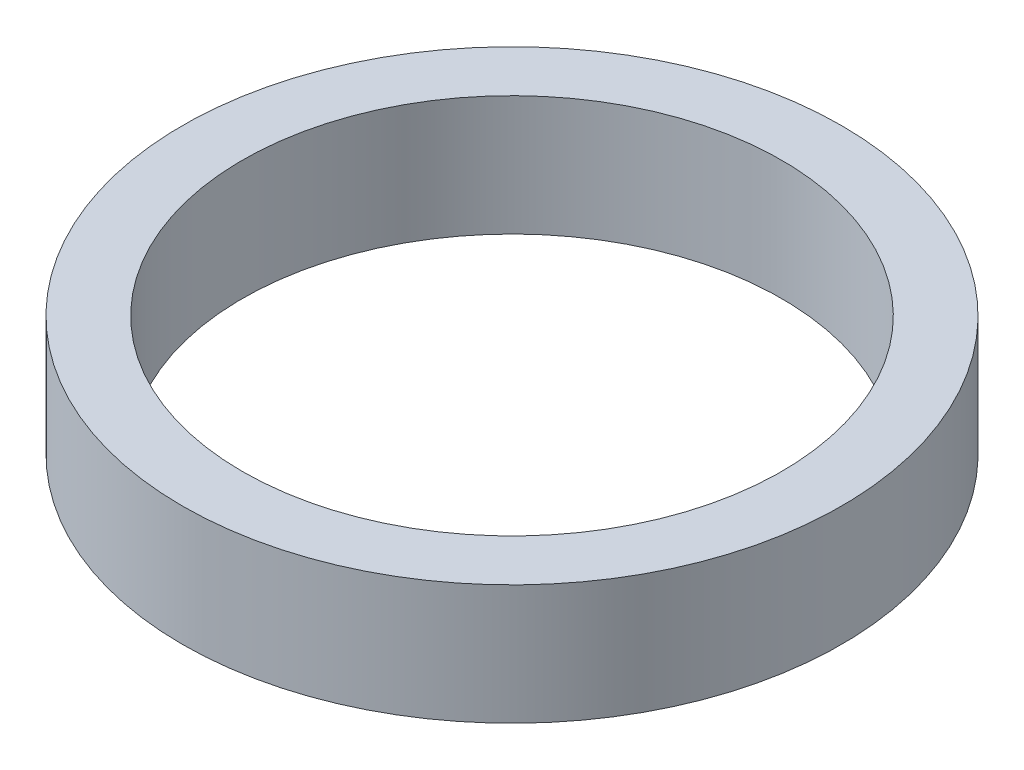
ISO-10303-21;
HEADER;
FILE_DESCRIPTION(('STEP AP214'),'2;1');
FILE_NAME('part.step','',(''),(''),'','','');
FILE_SCHEMA(('AUTOMOTIVE_DESIGN { 1 0 10303 214 1 1 1 1 }'));
ENDSEC;
DATA;
#1=APPLICATION_CONTEXT('core data for automotive mechanical design processes');
#2=APPLICATION_PROTOCOL_DEFINITION('international standard','automotive_design',2000,#1);
#3=PRODUCT_CONTEXT('',#1,'mechanical');
#4=PRODUCT('Part','Part','',(#3));
#5=PRODUCT_RELATED_PRODUCT_CATEGORY('part','',(#4));
#6=PRODUCT_DEFINITION_FORMATION('','',#4);
#7=PRODUCT_DEFINITION_CONTEXT('part definition',#1,'design');
#8=PRODUCT_DEFINITION('design','',#6,#7);
#9=PRODUCT_DEFINITION_SHAPE('','',#8);
#10=(LENGTH_UNIT() NAMED_UNIT(*) SI_UNIT(.MILLI.,.METRE.));
#11=(NAMED_UNIT(*) PLANE_ANGLE_UNIT() SI_UNIT($,.RADIAN.));
#12=(NAMED_UNIT(*) SI_UNIT($,.STERADIAN.) SOLID_ANGLE_UNIT());
#13=UNCERTAINTY_MEASURE_WITH_UNIT(LENGTH_MEASURE(1.E-05),#10,'distance_accuracy_value','');
#14=(GEOMETRIC_REPRESENTATION_CONTEXT(3) GLOBAL_UNCERTAINTY_ASSIGNED_CONTEXT((#13)) GLOBAL_UNIT_ASSIGNED_CONTEXT((#10,
#11,#12)) REPRESENTATION_CONTEXT('',''));
#15=CARTESIAN_POINT('',(0.,0.,0.));
#16=DIRECTION('',(0.,0.,1.));
#17=DIRECTION('',(1.,0.,0.));
#18=AXIS2_PLACEMENT_3D('',#15,#16,#17);
#19=CARTESIAN_POINT('',(0.,5.08,0.));
#20=DIRECTION('',(0.,-1.,0.));
#21=DIRECTION('',(0.,0.,-1.));
#22=AXIS2_PLACEMENT_3D('',#19,#20,#21);
#23=CYLINDRICAL_SURFACE('',#22,13.97);
#24=CARTESIAN_POINT('',(0.,5.08,0.));
#25=DIRECTION('',(0.,1.,0.));
#26=DIRECTION('',(0.,0.,1.));
#27=AXIS2_PLACEMENT_3D('',#24,#25,#26);
#28=CIRCLE('',#27,13.97);
#29=CARTESIAN_POINT('',(0.,5.08,13.97));
#30=VERTEX_POINT('',#29);
#31=EDGE_CURVE('E10',#30,#30,#28,.T.);
#32=ORIENTED_EDGE('',*,*,#31,.F.);
#33=EDGE_LOOP('',(#32));
#34=FACE_BOUND('',#33,.T.);
#35=CARTESIAN_POINT('',(0.,0.,0.));
#36=DIRECTION('',(0.,1.,0.));
#37=DIRECTION('',(0.,0.,1.));
#38=AXIS2_PLACEMENT_3D('',#35,#36,#37);
#39=CIRCLE('',#38,13.97);
#40=CARTESIAN_POINT('',(0.,0.,13.97));
#41=VERTEX_POINT('',#40);
#42=EDGE_CURVE('E33',#41,#41,#39,.T.);
#43=ORIENTED_EDGE('',*,*,#42,.T.);
#44=EDGE_LOOP('',(#43));
#45=FACE_BOUND('',#44,.T.);
#46=ADVANCED_FACE('F30',(#34,#45),#23,.T.);
#47=CARTESIAN_POINT('',(0.,5.08,0.));
#48=DIRECTION('',(0.,1.,0.));
#49=DIRECTION('',(0.,0.,1.));
#50=AXIS2_PLACEMENT_3D('',#47,#48,#49);
#51=PLANE('',#50);
#52=CARTESIAN_POINT('',(0.,5.08,0.));
#53=DIRECTION('',(0.,1.,0.));
#54=DIRECTION('',(0.,0.,1.));
#55=AXIS2_PLACEMENT_3D('',#52,#53,#54);
#56=CIRCLE('',#55,11.43);
#57=CARTESIAN_POINT('',(0.,5.08,11.43));
#58=VERTEX_POINT('',#57);
#59=EDGE_CURVE('E42',#58,#58,#56,.T.);
#60=ORIENTED_EDGE('',*,*,#59,.F.);
#61=EDGE_LOOP('',(#60));
#62=FACE_BOUND('',#61,.T.);
#63=ORIENTED_EDGE('',*,*,#31,.T.);
#64=EDGE_LOOP('',(#63));
#65=FACE_BOUND('',#64,.T.);
#66=ADVANCED_FACE('F57',(#62,#65),#51,.T.);
#67=CARTESIAN_POINT('',(0.,0.,0.));
#68=DIRECTION('',(0.,1.,0.));
#69=DIRECTION('',(0.,0.,1.));
#70=AXIS2_PLACEMENT_3D('',#67,#68,#69);
#71=PLANE('',#70);
#72=CARTESIAN_POINT('',(0.,0.,0.));
#73=DIRECTION('',(0.,1.,0.));
#74=DIRECTION('',(0.,0.,1.));
#75=AXIS2_PLACEMENT_3D('',#72,#73,#74);
#76=CIRCLE('',#75,11.43);
#77=CARTESIAN_POINT('',(0.,0.,11.43));
#78=VERTEX_POINT('',#77);
#79=EDGE_CURVE('E40',#78,#78,#76,.T.);
#80=ORIENTED_EDGE('',*,*,#79,.T.);
#81=EDGE_LOOP('',(#80));
#82=FACE_BOUND('',#81,.T.);
#83=ORIENTED_EDGE('',*,*,#42,.F.);
#84=EDGE_LOOP('',(#83));
#85=FACE_BOUND('',#84,.T.);
#86=ADVANCED_FACE('F48',(#82,#85),#71,.F.);
#87=CARTESIAN_POINT('',(0.,0.,0.));
#88=DIRECTION('',(0.,1.,0.));
#89=DIRECTION('',(0.,0.,1.));
#90=AXIS2_PLACEMENT_3D('',#87,#88,#89);
#91=CYLINDRICAL_SURFACE('',#90,11.43);
#92=ORIENTED_EDGE('',*,*,#79,.F.);
#93=EDGE_LOOP('',(#92));
#94=FACE_BOUND('',#93,.T.);
#95=ORIENTED_EDGE('',*,*,#59,.T.);
#96=EDGE_LOOP('',(#95));
#97=FACE_BOUND('',#96,.T.);
#98=ADVANCED_FACE('F51',(#94,#97),#91,.F.);
#99=CLOSED_SHELL('',(#46,#66,#86,#98));
#100=MANIFOLD_SOLID_BREP('B2',#99);
#101=ADVANCED_BREP_SHAPE_REPRESENTATION('',(#18,#100),#14);
#102=SHAPE_DEFINITION_REPRESENTATION(#9,#101);
ENDSEC;
END-ISO-10303-21;
